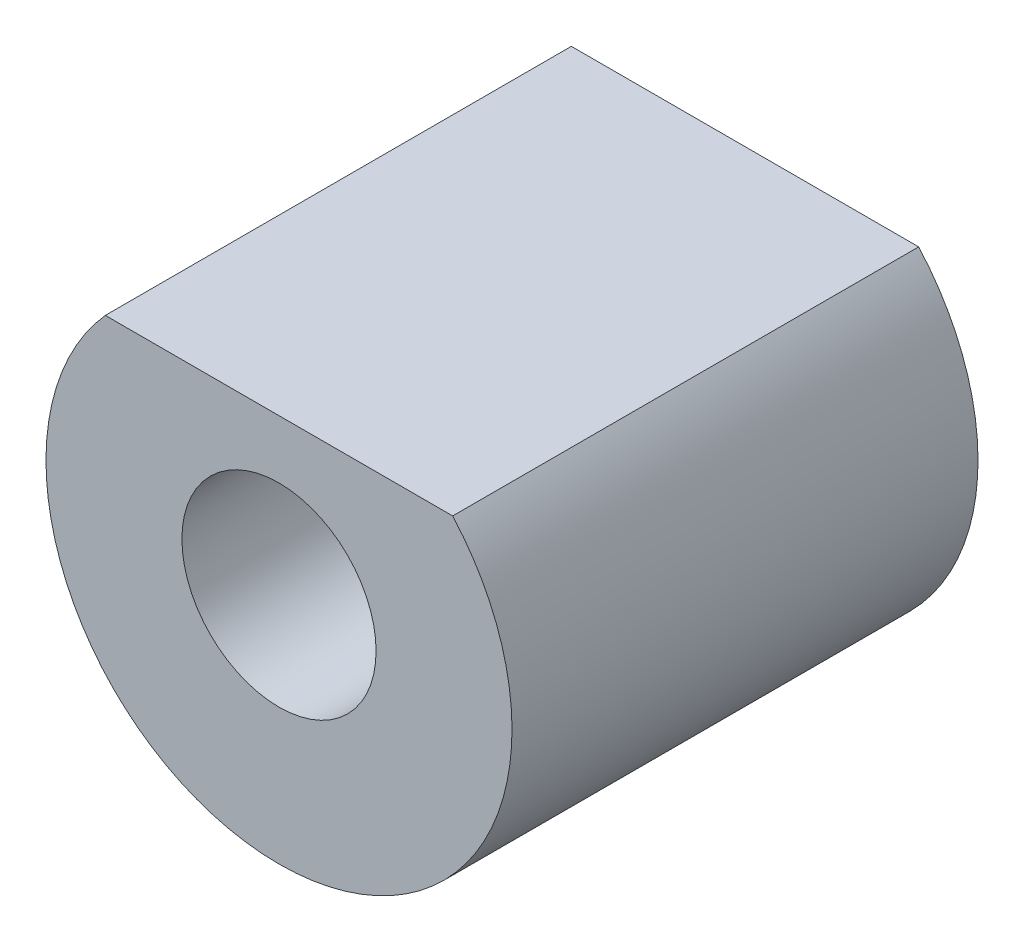
ISO-10303-21;
HEADER;
FILE_DESCRIPTION(('STEP AP214'),'2;1');
FILE_NAME('part.step','',(''),(''),'','','');
FILE_SCHEMA(('AUTOMOTIVE_DESIGN { 1 0 10303 214 1 1 1 1 }'));
ENDSEC;
DATA;
#1=APPLICATION_CONTEXT('core data for automotive mechanical design processes');
#2=APPLICATION_PROTOCOL_DEFINITION('international standard','automotive_design',2000,#1);
#3=PRODUCT_CONTEXT('',#1,'mechanical');
#4=PRODUCT('Part','Part','',(#3));
#5=PRODUCT_RELATED_PRODUCT_CATEGORY('part','',(#4));
#6=PRODUCT_DEFINITION_FORMATION('','',#4);
#7=PRODUCT_DEFINITION_CONTEXT('part definition',#1,'design');
#8=PRODUCT_DEFINITION('design','',#6,#7);
#9=PRODUCT_DEFINITION_SHAPE('','',#8);
#10=(LENGTH_UNIT() NAMED_UNIT(*) SI_UNIT(.MILLI.,.METRE.));
#11=(NAMED_UNIT(*) PLANE_ANGLE_UNIT() SI_UNIT($,.RADIAN.));
#12=(NAMED_UNIT(*) SI_UNIT($,.STERADIAN.) SOLID_ANGLE_UNIT());
#13=UNCERTAINTY_MEASURE_WITH_UNIT(LENGTH_MEASURE(1.E-05),#10,'distance_accuracy_value','');
#14=(GEOMETRIC_REPRESENTATION_CONTEXT(3) GLOBAL_UNCERTAINTY_ASSIGNED_CONTEXT((#13)) GLOBAL_UNIT_ASSIGNED_CONTEXT((#10,
#11,#12)) REPRESENTATION_CONTEXT('',''));
#15=CARTESIAN_POINT('',(0.,0.,0.));
#16=DIRECTION('',(0.,0.,1.));
#17=DIRECTION('',(1.,0.,0.));
#18=AXIS2_PLACEMENT_3D('',#15,#16,#17);
#19=CARTESIAN_POINT('',(0.,0.,6.));
#20=DIRECTION('',(0.,0.,1.));
#21=DIRECTION('',(1.,0.,0.));
#22=AXIS2_PLACEMENT_3D('',#19,#20,#21);
#23=PLANE('',#22);
#24=CARTESIAN_POINT('',(0.,0.,6.));
#25=DIRECTION('',(0.,0.,1.));
#26=DIRECTION('',(1.,0.,0.));
#27=AXIS2_PLACEMENT_3D('',#24,#25,#26);
#28=CIRCLE('',#27,3.);
#29=CARTESIAN_POINT('',(-2.23606797749979,2.,6.));
#30=VERTEX_POINT('',#29);
#31=CARTESIAN_POINT('',(2.23606797749979,2.,6.));
#32=VERTEX_POINT('',#31);
#33=EDGE_CURVE('E72',#30,#32,#28,.T.);
#34=ORIENTED_EDGE('',*,*,#33,.T.);
#35=DIRECTION('',(-1.,0.,0.));
#36=VECTOR('',#35,1.);
#37=CARTESIAN_POINT('',(-2.23606797749979,2.,6.));
#38=LINE('',#37,#36);
#39=EDGE_CURVE('E56',#32,#30,#38,.T.);
#40=ORIENTED_EDGE('',*,*,#39,.T.);
#41=EDGE_LOOP('',(#34,#40));
#42=FACE_BOUND('',#41,.T.);
#43=CARTESIAN_POINT('',(0.,0.,6.));
#44=DIRECTION('',(0.,0.,1.));
#45=DIRECTION('',(1.,0.,0.));
#46=AXIS2_PLACEMENT_3D('',#43,#44,#45);
#47=CIRCLE('',#46,1.25);
#48=CARTESIAN_POINT('',(1.25,0.,6.));
#49=VERTEX_POINT('',#48);
#50=EDGE_CURVE('E80',#49,#49,#47,.T.);
#51=ORIENTED_EDGE('',*,*,#50,.F.);
#52=EDGE_LOOP('',(#51));
#53=FACE_BOUND('',#52,.T.);
#54=ADVANCED_FACE('F39',(#42,#53),#23,.T.);
#55=CARTESIAN_POINT('',(0.,0.,0.));
#56=DIRECTION('',(0.,0.,1.));
#57=DIRECTION('',(1.,0.,0.));
#58=AXIS2_PLACEMENT_3D('',#55,#56,#57);
#59=PLANE('',#58);
#60=CARTESIAN_POINT('',(0.,0.,0.));
#61=DIRECTION('',(0.,0.,1.));
#62=DIRECTION('',(1.,0.,0.));
#63=AXIS2_PLACEMENT_3D('',#60,#61,#62);
#64=CIRCLE('',#63,3.);
#65=CARTESIAN_POINT('',(-2.23606797749979,2.,0.));
#66=VERTEX_POINT('',#65);
#67=CARTESIAN_POINT('',(2.23606797749979,2.,0.));
#68=VERTEX_POINT('',#67);
#69=EDGE_CURVE('E73',#66,#68,#64,.T.);
#70=ORIENTED_EDGE('',*,*,#69,.F.);
#71=DIRECTION('',(-1.,0.,0.));
#72=VECTOR('',#71,1.);
#73=CARTESIAN_POINT('',(-2.23606797749979,2.,0.));
#74=LINE('',#73,#72);
#75=EDGE_CURVE('E64',#68,#66,#74,.T.);
#76=ORIENTED_EDGE('',*,*,#75,.F.);
#77=EDGE_LOOP('',(#70,#76));
#78=FACE_BOUND('',#77,.T.);
#79=CARTESIAN_POINT('',(0.,0.,0.));
#80=DIRECTION('',(0.,0.,1.));
#81=DIRECTION('',(1.,0.,0.));
#82=AXIS2_PLACEMENT_3D('',#79,#80,#81);
#83=CIRCLE('',#82,1.25);
#84=CARTESIAN_POINT('',(1.25,0.,0.));
#85=VERTEX_POINT('',#84);
#86=EDGE_CURVE('E84',#85,#85,#83,.T.);
#87=ORIENTED_EDGE('',*,*,#86,.T.);
#88=EDGE_LOOP('',(#87));
#89=FACE_BOUND('',#88,.T.);
#90=ADVANCED_FACE('F77',(#78,#89),#59,.F.);
#91=CARTESIAN_POINT('',(0.,0.,6.));
#92=DIRECTION('',(0.,0.,-1.));
#93=DIRECTION('',(-1.,0.,0.));
#94=AXIS2_PLACEMENT_3D('',#91,#92,#93);
#95=CYLINDRICAL_SURFACE('',#94,3.);
#96=ORIENTED_EDGE('',*,*,#69,.T.);
#97=DIRECTION('',(0.,0.,-1.));
#98=VECTOR('',#97,1.);
#99=CARTESIAN_POINT('',(2.23606797749979,2.,6.));
#100=LINE('',#99,#98);
#101=EDGE_CURVE('E11',#32,#68,#100,.T.);
#102=ORIENTED_EDGE('',*,*,#101,.F.);
#103=ORIENTED_EDGE('',*,*,#33,.F.);
#104=DIRECTION('',(0.,0.,-1.));
#105=VECTOR('',#104,1.);
#106=CARTESIAN_POINT('',(-2.23606797749979,2.,6.));
#107=LINE('',#106,#105);
#108=EDGE_CURVE('E49',#30,#66,#107,.T.);
#109=ORIENTED_EDGE('',*,*,#108,.T.);
#110=EDGE_LOOP('',(#96,#102,#103,#109));
#111=FACE_BOUND('',#110,.T.);
#112=ADVANCED_FACE('F41',(#111),#95,.T.);
#113=CARTESIAN_POINT('',(-2.23606797749979,2.,6.));
#114=DIRECTION('',(0.,-1.,0.));
#115=DIRECTION('',(0.,0.,-1.));
#116=AXIS2_PLACEMENT_3D('',#113,#114,#115);
#117=PLANE('',#116);
#118=ORIENTED_EDGE('',*,*,#75,.T.);
#119=ORIENTED_EDGE('',*,*,#108,.F.);
#120=ORIENTED_EDGE('',*,*,#39,.F.);
#121=ORIENTED_EDGE('',*,*,#101,.T.);
#122=EDGE_LOOP('',(#118,#119,#120,#121));
#123=FACE_BOUND('',#122,.T.);
#124=ADVANCED_FACE('F67',(#123),#117,.F.);
#125=CARTESIAN_POINT('',(0.,0.,6.));
#126=DIRECTION('',(0.,0.,-1.));
#127=DIRECTION('',(-1.,0.,0.));
#128=AXIS2_PLACEMENT_3D('',#125,#126,#127);
#129=CYLINDRICAL_SURFACE('',#128,1.25);
#130=ORIENTED_EDGE('',*,*,#50,.T.);
#131=EDGE_LOOP('',(#130));
#132=FACE_BOUND('',#131,.T.);
#133=ORIENTED_EDGE('',*,*,#86,.F.);
#134=EDGE_LOOP('',(#133));
#135=FACE_BOUND('',#134,.T.);
#136=ADVANCED_FACE('F95',(#132,#135),#129,.F.);
#137=CLOSED_SHELL('',(#54,#90,#112,#124,#136));
#138=MANIFOLD_SOLID_BREP('B2',#137);
#139=ADVANCED_BREP_SHAPE_REPRESENTATION('',(#18,#138),#14);
#140=SHAPE_DEFINITION_REPRESENTATION(#9,#139);
ENDSEC;
END-ISO-10303-21;
